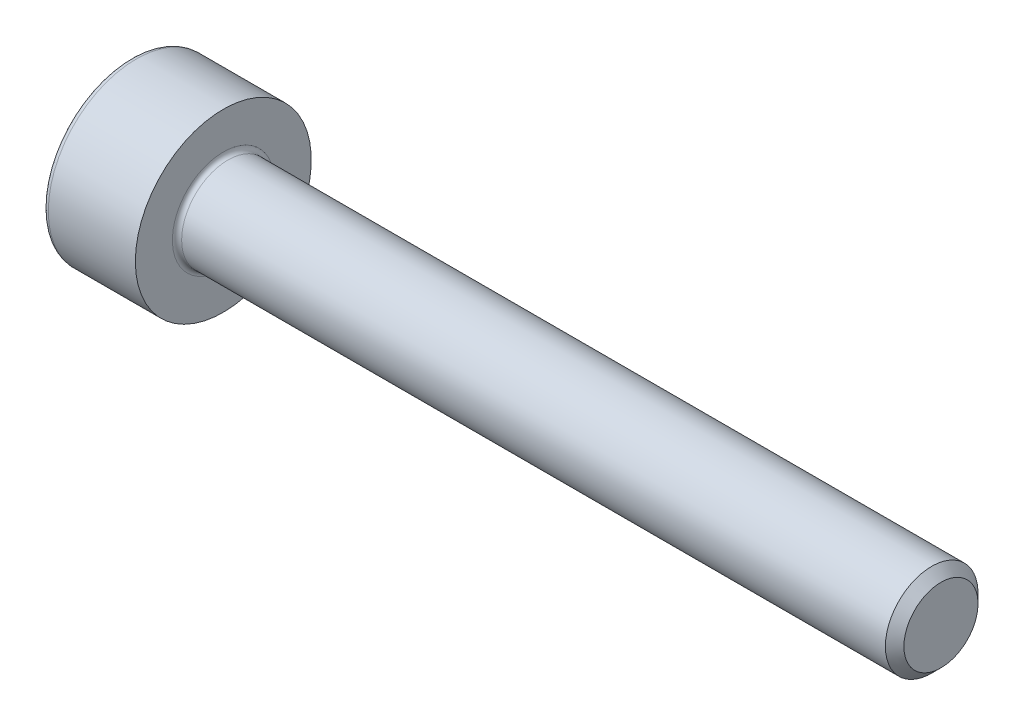
ISO-10303-21;
HEADER;
FILE_DESCRIPTION(('STEP AP214'),'2;1');
FILE_NAME('part.step','',(''),(''),'','','');
FILE_SCHEMA(('AUTOMOTIVE_DESIGN { 1 0 10303 214 1 1 1 1 }'));
ENDSEC;
DATA;
#1=APPLICATION_CONTEXT('core data for automotive mechanical design processes');
#2=APPLICATION_PROTOCOL_DEFINITION('international standard','automotive_design',2000,#1);
#3=PRODUCT_CONTEXT('',#1,'mechanical');
#4=PRODUCT('Part','Part','',(#3));
#5=PRODUCT_RELATED_PRODUCT_CATEGORY('part','',(#4));
#6=PRODUCT_DEFINITION_FORMATION('','',#4);
#7=PRODUCT_DEFINITION_CONTEXT('part definition',#1,'design');
#8=PRODUCT_DEFINITION('design','',#6,#7);
#9=PRODUCT_DEFINITION_SHAPE('','',#8);
#10=(LENGTH_UNIT() NAMED_UNIT(*) SI_UNIT(.MILLI.,.METRE.));
#11=(NAMED_UNIT(*) PLANE_ANGLE_UNIT() SI_UNIT($,.RADIAN.));
#12=(NAMED_UNIT(*) SI_UNIT($,.STERADIAN.) SOLID_ANGLE_UNIT());
#13=UNCERTAINTY_MEASURE_WITH_UNIT(LENGTH_MEASURE(1.E-05),#10,'distance_accuracy_value','');
#14=(GEOMETRIC_REPRESENTATION_CONTEXT(3) GLOBAL_UNCERTAINTY_ASSIGNED_CONTEXT((#13)) GLOBAL_UNIT_ASSIGNED_CONTEXT((#10,
#11,#12)) REPRESENTATION_CONTEXT('',''));
#15=CARTESIAN_POINT('',(0.,0.,0.));
#16=DIRECTION('',(0.,0.,1.));
#17=DIRECTION('',(1.,0.,0.));
#18=AXIS2_PLACEMENT_3D('',#15,#16,#17);
#19=CARTESIAN_POINT('',(17.5000000000048,0.,0.));
#20=DIRECTION('',(-1.,0.,0.));
#21=DIRECTION('',(0.,0.,1.));
#22=AXIS2_PLACEMENT_3D('',#19,#20,#21);
#23=PLANE('',#22);
#24=CARTESIAN_POINT('',(17.5000000000048,0.,0.));
#25=DIRECTION('',(-1.,0.,0.));
#26=DIRECTION('',(0.,0.,1.));
#27=AXIS2_PLACEMENT_3D('',#24,#25,#26);
#28=CIRCLE('',#27,0.800000000000002);
#29=CARTESIAN_POINT('',(17.5000000000048,0.,0.800000000000002));
#30=VERTEX_POINT('',#29);
#31=EDGE_CURVE('E11',#30,#30,#28,.F.);
#32=ORIENTED_EDGE('',*,*,#31,.T.);
#33=EDGE_LOOP('',(#32));
#34=FACE_BOUND('',#33,.T.);
#35=ADVANCED_FACE('F36',(#34),#23,.F.);
#36=CARTESIAN_POINT('',(0.,0.,0.));
#37=DIRECTION('',(-1.,0.,0.));
#38=DIRECTION('',(0.,0.,1.));
#39=AXIS2_PLACEMENT_3D('',#36,#37,#38);
#40=CYLINDRICAL_SURFACE('',#39,1.);
#41=CARTESIAN_POINT('',(17.3000000000048,0.,0.));
#42=DIRECTION('',(-1.,0.,0.));
#43=DIRECTION('',(0.,0.,1.));
#44=AXIS2_PLACEMENT_3D('',#41,#42,#43);
#45=CIRCLE('',#44,1.);
#46=CARTESIAN_POINT('',(17.3000000000048,0.,1.));
#47=VERTEX_POINT('',#46);
#48=EDGE_CURVE('E44',#47,#47,#45,.T.);
#49=ORIENTED_EDGE('',*,*,#48,.T.);
#50=EDGE_LOOP('',(#49));
#51=FACE_BOUND('',#50,.T.);
#52=CARTESIAN_POINT('',(2.10000000000477,0.,0.));
#53=DIRECTION('',(1.,0.,0.));
#54=DIRECTION('',(0.,0.,-1.));
#55=AXIS2_PLACEMENT_3D('',#52,#53,#54);
#56=CIRCLE('',#55,1.);
#57=CARTESIAN_POINT('',(2.10000000000477,0.,-1.));
#58=VERTEX_POINT('',#57);
#59=EDGE_CURVE('E149',#58,#58,#56,.T.);
#60=ORIENTED_EDGE('',*,*,#59,.T.);
#61=EDGE_LOOP('',(#60));
#62=FACE_BOUND('',#61,.T.);
#63=ADVANCED_FACE('F160',(#51,#62),#40,.T.);
#64=CARTESIAN_POINT('',(2.00000000000477,0.,0.));
#65=DIRECTION('',(1.,0.,0.));
#66=DIRECTION('',(0.,0.,-1.));
#67=AXIS2_PLACEMENT_3D('',#64,#65,#66);
#68=PLANE('',#67);
#69=CARTESIAN_POINT('',(2.00000000000477,0.,0.));
#70=DIRECTION('',(1.,0.,0.));
#71=DIRECTION('',(0.,0.,-1.));
#72=AXIS2_PLACEMENT_3D('',#69,#70,#71);
#73=CIRCLE('',#72,1.1);
#74=CARTESIAN_POINT('',(2.00000000000477,0.,-1.1));
#75=VERTEX_POINT('',#74);
#76=EDGE_CURVE('E146',#75,#75,#73,.F.);
#77=ORIENTED_EDGE('',*,*,#76,.T.);
#78=EDGE_LOOP('',(#77));
#79=FACE_BOUND('',#78,.T.);
#80=CARTESIAN_POINT('',(2.00000000000477,0.,0.));
#81=DIRECTION('',(-1.,0.,0.));
#82=DIRECTION('',(0.,0.,1.));
#83=AXIS2_PLACEMENT_3D('',#80,#81,#82);
#84=CIRCLE('',#83,1.9);
#85=CARTESIAN_POINT('',(2.00000000000477,0.,1.9));
#86=VERTEX_POINT('',#85);
#87=EDGE_CURVE('E138',#86,#86,#84,.T.);
#88=ORIENTED_EDGE('',*,*,#87,.F.);
#89=EDGE_LOOP('',(#88));
#90=FACE_BOUND('',#89,.T.);
#91=ADVANCED_FACE('F182',(#79,#90),#68,.T.);
#92=CARTESIAN_POINT('',(0.,0.,0.));
#93=DIRECTION('',(-1.,0.,0.));
#94=DIRECTION('',(0.,0.,1.));
#95=AXIS2_PLACEMENT_3D('',#92,#93,#94);
#96=CYLINDRICAL_SURFACE('',#95,1.9);
#97=CARTESIAN_POINT('',(0.12,0.,0.));
#98=DIRECTION('',(-1.,0.,0.));
#99=DIRECTION('',(0.,0.,1.));
#100=AXIS2_PLACEMENT_3D('',#97,#98,#99);
#101=CIRCLE('',#100,1.9);
#102=CARTESIAN_POINT('',(0.12,0.,1.9));
#103=VERTEX_POINT('',#102);
#104=EDGE_CURVE('E155',#103,#103,#101,.F.);
#105=ORIENTED_EDGE('',*,*,#104,.T.);
#106=EDGE_LOOP('',(#105));
#107=FACE_BOUND('',#106,.T.);
#108=ORIENTED_EDGE('',*,*,#87,.T.);
#109=EDGE_LOOP('',(#108));
#110=FACE_BOUND('',#109,.T.);
#111=ADVANCED_FACE('F192',(#107,#110),#96,.T.);
#112=CARTESIAN_POINT('',(0.,0.,0.));
#113=DIRECTION('',(-1.,0.,0.));
#114=DIRECTION('',(0.,0.,1.));
#115=AXIS2_PLACEMENT_3D('',#112,#113,#114);
#116=PLANE('',#115);
#117=DIRECTION('',(0.,0.5,-0.866025403784439));
#118=VECTOR('',#117,1.);
#119=CARTESIAN_POINT('',(0.,0.43301270189222,0.749999999999999));
#120=LINE('',#119,#118);
#121=CARTESIAN_POINT('',(0.,0.43301270189222,0.749999999999999));
#122=VERTEX_POINT('',#121);
#123=CARTESIAN_POINT('',(0.,0.866025403784438,0.));
#124=VERTEX_POINT('',#123);
#125=EDGE_CURVE('E51',#122,#124,#120,.T.);
#126=ORIENTED_EDGE('',*,*,#125,.F.);
#127=DIRECTION('',(0.,1.,0.));
#128=VECTOR('',#127,1.);
#129=CARTESIAN_POINT('',(0.,-0.43301270189222,0.749999999999999));
#130=LINE('',#129,#128);
#131=CARTESIAN_POINT('',(0.,-0.43301270189222,0.749999999999999));
#132=VERTEX_POINT('',#131);
#133=EDGE_CURVE('E134',#132,#122,#130,.T.);
#134=ORIENTED_EDGE('',*,*,#133,.F.);
#135=DIRECTION('',(0.,0.5,0.866025403784439));
#136=VECTOR('',#135,1.);
#137=CARTESIAN_POINT('',(0.,-0.866025403784438,0.));
#138=LINE('',#137,#136);
#139=CARTESIAN_POINT('',(0.,-0.866025403784438,0.));
#140=VERTEX_POINT('',#139);
#141=EDGE_CURVE('E132',#140,#132,#138,.T.);
#142=ORIENTED_EDGE('',*,*,#141,.F.);
#143=DIRECTION('',(0.,-0.5,0.866025403784439));
#144=VECTOR('',#143,1.);
#145=CARTESIAN_POINT('',(0.,-0.433012701892219,-0.75));
#146=LINE('',#145,#144);
#147=CARTESIAN_POINT('',(0.,-0.433012701892219,-0.75));
#148=VERTEX_POINT('',#147);
#149=EDGE_CURVE('E99',#148,#140,#146,.T.);
#150=ORIENTED_EDGE('',*,*,#149,.F.);
#151=DIRECTION('',(0.,-1.,0.));
#152=VECTOR('',#151,1.);
#153=CARTESIAN_POINT('',(0.,0.433012701892219,-0.75));
#154=LINE('',#153,#152);
#155=CARTESIAN_POINT('',(0.,0.433012701892219,-0.75));
#156=VERTEX_POINT('',#155);
#157=EDGE_CURVE('E128',#156,#148,#154,.T.);
#158=ORIENTED_EDGE('',*,*,#157,.F.);
#159=DIRECTION('',(0.,-0.5,-0.866025403784439));
#160=VECTOR('',#159,1.);
#161=CARTESIAN_POINT('',(0.,0.866025403784438,0.));
#162=LINE('',#161,#160);
#163=EDGE_CURVE('E125',#124,#156,#162,.T.);
#164=ORIENTED_EDGE('',*,*,#163,.F.);
#165=EDGE_LOOP('',(#126,#134,#142,#150,#158,#164));
#166=FACE_BOUND('',#165,.T.);
#167=CARTESIAN_POINT('',(0.,0.,0.));
#168=DIRECTION('',(-1.,0.,0.));
#169=DIRECTION('',(0.,0.,1.));
#170=AXIS2_PLACEMENT_3D('',#167,#168,#169);
#171=CIRCLE('',#170,1.78);
#172=CARTESIAN_POINT('',(0.,0.,1.78));
#173=VERTEX_POINT('',#172);
#174=EDGE_CURVE('E152',#173,#173,#171,.T.);
#175=ORIENTED_EDGE('',*,*,#174,.T.);
#176=EDGE_LOOP('',(#175));
#177=FACE_BOUND('',#176,.T.);
#178=ADVANCED_FACE('F187',(#166,#177),#116,.T.);
#179=CARTESIAN_POINT('',(2.10000000000477,0.,0.));
#180=DIRECTION('',(1.,0.,0.));
#181=DIRECTION('',(0.,0.,-1.));
#182=AXIS2_PLACEMENT_3D('',#179,#180,#181);
#183=TOROIDAL_SURFACE('',#182,1.1,0.1);
#184=ORIENTED_EDGE('',*,*,#59,.F.);
#185=EDGE_LOOP('',(#184));
#186=FACE_BOUND('',#185,.T.);
#187=ORIENTED_EDGE('',*,*,#76,.F.);
#188=EDGE_LOOP('',(#187));
#189=FACE_BOUND('',#188,.T.);
#190=ADVANCED_FACE('F173',(#186,#189),#183,.F.);
#191=CARTESIAN_POINT('',(0.12,0.,0.));
#192=DIRECTION('',(-1.,0.,0.));
#193=DIRECTION('',(0.,0.,1.));
#194=AXIS2_PLACEMENT_3D('',#191,#192,#193);
#195=TOROIDAL_SURFACE('',#194,1.78,0.12);
#196=ORIENTED_EDGE('',*,*,#104,.F.);
#197=EDGE_LOOP('',(#196));
#198=FACE_BOUND('',#197,.T.);
#199=ORIENTED_EDGE('',*,*,#174,.F.);
#200=EDGE_LOOP('',(#199));
#201=FACE_BOUND('',#200,.T.);
#202=ADVANCED_FACE('F165',(#198,#201),#195,.T.);
#203=CARTESIAN_POINT('',(17.3000000000048,0.,0.));
#204=DIRECTION('',(-1.,0.,0.));
#205=DIRECTION('',(0.,0.,1.));
#206=AXIS2_PLACEMENT_3D('',#203,#204,#205);
#207=CONICAL_SURFACE('',#206,1.,0.785398163397441);
#208=ORIENTED_EDGE('',*,*,#31,.F.);
#209=EDGE_LOOP('',(#208));
#210=FACE_BOUND('',#209,.T.);
#211=ORIENTED_EDGE('',*,*,#48,.F.);
#212=EDGE_LOOP('',(#211));
#213=FACE_BOUND('',#212,.T.);
#214=ADVANCED_FACE('F38',(#210,#213),#207,.T.);
#215=CARTESIAN_POINT('',(1.,0.43301270189222,0.749999999999999));
#216=DIRECTION('',(0.,0.866025403784439,0.5));
#217=DIRECTION('',(0.,-0.5,0.866025403784439));
#218=AXIS2_PLACEMENT_3D('',#215,#216,#217);
#219=PLANE('',#218);
#220=ORIENTED_EDGE('',*,*,#125,.T.);
#221=DIRECTION('',(-1.,0.,0.));
#222=VECTOR('',#221,1.);
#223=CARTESIAN_POINT('',(1.,0.866025403784438,0.));
#224=LINE('',#223,#222);
#225=CARTESIAN_POINT('',(1.,0.866025403784438,0.));
#226=VERTEX_POINT('',#225);
#227=EDGE_CURVE('E81',#226,#124,#224,.T.);
#228=ORIENTED_EDGE('',*,*,#227,.F.);
#229=DIRECTION('',(0.,0.5,-0.866025403784439));
#230=VECTOR('',#229,1.);
#231=CARTESIAN_POINT('',(1.,0.43301270189222,0.749999999999999));
#232=LINE('',#231,#230);
#233=CARTESIAN_POINT('',(1.,0.43301270189222,0.749999999999999));
#234=VERTEX_POINT('',#233);
#235=EDGE_CURVE('E136',#234,#226,#232,.T.);
#236=ORIENTED_EDGE('',*,*,#235,.F.);
#237=DIRECTION('',(-1.,0.,0.));
#238=VECTOR('',#237,1.);
#239=CARTESIAN_POINT('',(1.,0.43301270189222,0.749999999999999));
#240=LINE('',#239,#238);
#241=EDGE_CURVE('E59',#234,#122,#240,.T.);
#242=ORIENTED_EDGE('',*,*,#241,.T.);
#243=EDGE_LOOP('',(#220,#228,#236,#242));
#244=FACE_BOUND('',#243,.T.);
#245=ADVANCED_FACE('F164',(#244),#219,.F.);
#246=CARTESIAN_POINT('',(1.,-0.43301270189222,0.749999999999999));
#247=DIRECTION('',(0.,0.,1.));
#248=DIRECTION('',(0.,-1.,0.));
#249=AXIS2_PLACEMENT_3D('',#246,#247,#248);
#250=PLANE('',#249);
#251=ORIENTED_EDGE('',*,*,#133,.T.);
#252=ORIENTED_EDGE('',*,*,#241,.F.);
#253=DIRECTION('',(0.,1.,0.));
#254=VECTOR('',#253,1.);
#255=CARTESIAN_POINT('',(1.,-0.43301270189222,0.749999999999999));
#256=LINE('',#255,#254);
#257=CARTESIAN_POINT('',(1.,-0.43301270189222,0.749999999999999));
#258=VERTEX_POINT('',#257);
#259=EDGE_CURVE('E111',#258,#234,#256,.T.);
#260=ORIENTED_EDGE('',*,*,#259,.F.);
#261=DIRECTION('',(-1.,0.,0.));
#262=VECTOR('',#261,1.);
#263=CARTESIAN_POINT('',(1.,-0.43301270189222,0.749999999999999));
#264=LINE('',#263,#262);
#265=EDGE_CURVE('E103',#258,#132,#264,.T.);
#266=ORIENTED_EDGE('',*,*,#265,.T.);
#267=EDGE_LOOP('',(#251,#252,#260,#266));
#268=FACE_BOUND('',#267,.T.);
#269=ADVANCED_FACE('F171',(#268),#250,.F.);
#270=CARTESIAN_POINT('',(1.,-0.866025403784438,0.));
#271=DIRECTION('',(0.,-0.866025403784439,0.5));
#272=DIRECTION('',(0.,-0.5,-0.866025403784439));
#273=AXIS2_PLACEMENT_3D('',#270,#271,#272);
#274=PLANE('',#273);
#275=ORIENTED_EDGE('',*,*,#141,.T.);
#276=ORIENTED_EDGE('',*,*,#265,.F.);
#277=DIRECTION('',(0.,0.5,0.866025403784439));
#278=VECTOR('',#277,1.);
#279=CARTESIAN_POINT('',(1.,-0.866025403784438,0.));
#280=LINE('',#279,#278);
#281=CARTESIAN_POINT('',(1.,-0.866025403784438,0.));
#282=VERTEX_POINT('',#281);
#283=EDGE_CURVE('E107',#282,#258,#280,.T.);
#284=ORIENTED_EDGE('',*,*,#283,.F.);
#285=DIRECTION('',(-1.,0.,0.));
#286=VECTOR('',#285,1.);
#287=CARTESIAN_POINT('',(1.,-0.866025403784438,0.));
#288=LINE('',#287,#286);
#289=EDGE_CURVE('E92',#282,#140,#288,.T.);
#290=ORIENTED_EDGE('',*,*,#289,.T.);
#291=EDGE_LOOP('',(#275,#276,#284,#290));
#292=FACE_BOUND('',#291,.T.);
#293=ADVANCED_FACE('F108',(#292),#274,.F.);
#294=CARTESIAN_POINT('',(1.,-0.433012701892219,-0.75));
#295=DIRECTION('',(0.,-0.866025403784439,-0.5));
#296=DIRECTION('',(0.,0.5,-0.866025403784439));
#297=AXIS2_PLACEMENT_3D('',#294,#295,#296);
#298=PLANE('',#297);
#299=ORIENTED_EDGE('',*,*,#149,.T.);
#300=ORIENTED_EDGE('',*,*,#289,.F.);
#301=DIRECTION('',(0.,-0.5,0.866025403784439));
#302=VECTOR('',#301,1.);
#303=CARTESIAN_POINT('',(1.,-0.433012701892219,-0.75));
#304=LINE('',#303,#302);
#305=CARTESIAN_POINT('',(1.,-0.433012701892219,-0.75));
#306=VERTEX_POINT('',#305);
#307=EDGE_CURVE('E96',#306,#282,#304,.T.);
#308=ORIENTED_EDGE('',*,*,#307,.F.);
#309=DIRECTION('',(-1.,0.,0.));
#310=VECTOR('',#309,1.);
#311=CARTESIAN_POINT('',(1.,-0.433012701892219,-0.75));
#312=LINE('',#311,#310);
#313=EDGE_CURVE('E104',#306,#148,#312,.T.);
#314=ORIENTED_EDGE('',*,*,#313,.T.);
#315=EDGE_LOOP('',(#299,#300,#308,#314));
#316=FACE_BOUND('',#315,.T.);
#317=ADVANCED_FACE('F94',(#316),#298,.F.);
#318=CARTESIAN_POINT('',(1.,0.433012701892219,-0.75));
#319=DIRECTION('',(0.,0.,-1.));
#320=DIRECTION('',(0.,1.,0.));
#321=AXIS2_PLACEMENT_3D('',#318,#319,#320);
#322=PLANE('',#321);
#323=ORIENTED_EDGE('',*,*,#157,.T.);
#324=ORIENTED_EDGE('',*,*,#313,.F.);
#325=DIRECTION('',(0.,-1.,0.));
#326=VECTOR('',#325,1.);
#327=CARTESIAN_POINT('',(1.,0.433012701892219,-0.75));
#328=LINE('',#327,#326);
#329=CARTESIAN_POINT('',(1.,0.433012701892219,-0.75));
#330=VERTEX_POINT('',#329);
#331=EDGE_CURVE('E117',#330,#306,#328,.T.);
#332=ORIENTED_EDGE('',*,*,#331,.F.);
#333=DIRECTION('',(-1.,0.,0.));
#334=VECTOR('',#333,1.);
#335=CARTESIAN_POINT('',(1.,0.433012701892219,-0.75));
#336=LINE('',#335,#334);
#337=EDGE_CURVE('E141',#330,#156,#336,.T.);
#338=ORIENTED_EDGE('',*,*,#337,.T.);
#339=EDGE_LOOP('',(#323,#324,#332,#338));
#340=FACE_BOUND('',#339,.T.);
#341=ADVANCED_FACE('F212',(#340),#322,.F.);
#342=CARTESIAN_POINT('',(1.,0.866025403784438,0.));
#343=DIRECTION('',(0.,0.866025403784439,-0.5));
#344=DIRECTION('',(0.,0.5,0.866025403784439));
#345=AXIS2_PLACEMENT_3D('',#342,#343,#344);
#346=PLANE('',#345);
#347=ORIENTED_EDGE('',*,*,#163,.T.);
#348=ORIENTED_EDGE('',*,*,#337,.F.);
#349=DIRECTION('',(0.,-0.5,-0.866025403784439));
#350=VECTOR('',#349,1.);
#351=CARTESIAN_POINT('',(1.,0.866025403784438,0.));
#352=LINE('',#351,#350);
#353=EDGE_CURVE('E119',#226,#330,#352,.T.);
#354=ORIENTED_EDGE('',*,*,#353,.F.);
#355=ORIENTED_EDGE('',*,*,#227,.T.);
#356=EDGE_LOOP('',(#347,#348,#354,#355));
#357=FACE_BOUND('',#356,.T.);
#358=ADVANCED_FACE('F209',(#357),#346,.F.);
#359=CARTESIAN_POINT('',(1.,0.,0.));
#360=DIRECTION('',(-1.,0.,0.));
#361=DIRECTION('',(0.,0.,1.));
#362=AXIS2_PLACEMENT_3D('',#359,#360,#361);
#363=PLANE('',#362);
#364=ORIENTED_EDGE('',*,*,#235,.T.);
#365=ORIENTED_EDGE('',*,*,#353,.T.);
#366=ORIENTED_EDGE('',*,*,#331,.T.);
#367=ORIENTED_EDGE('',*,*,#307,.T.);
#368=ORIENTED_EDGE('',*,*,#283,.T.);
#369=ORIENTED_EDGE('',*,*,#259,.T.);
#370=EDGE_LOOP('',(#364,#365,#366,#367,#368,#369));
#371=FACE_BOUND('',#370,.T.);
#372=ADVANCED_FACE('F114',(#371),#363,.T.);
#373=CLOSED_SHELL('',(#35,#63,#91,#111,#178,#190,#202,#214,#245,#269,#293,#317,#341,#358,#372));
#374=MANIFOLD_SOLID_BREP('B2',#373);
#375=ADVANCED_BREP_SHAPE_REPRESENTATION('',(#18,#374),#14);
#376=SHAPE_DEFINITION_REPRESENTATION(#9,#375);
ENDSEC;
END-ISO-10303-21;
